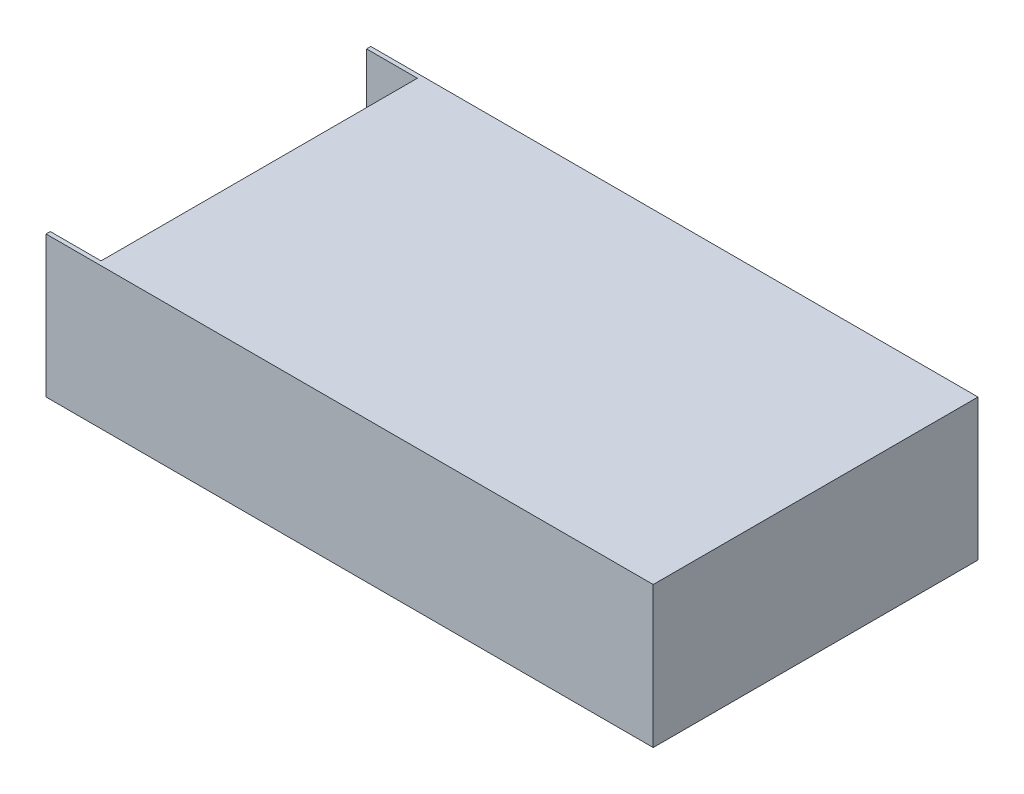
ISO-10303-21;
HEADER;
FILE_DESCRIPTION(('STEP AP214'),'2;1');
FILE_NAME('part.step','',(''),(''),'','','');
FILE_SCHEMA(('AUTOMOTIVE_DESIGN { 1 0 10303 214 1 1 1 1 }'));
ENDSEC;
DATA;
#1=APPLICATION_CONTEXT('core data for automotive mechanical design processes');
#2=APPLICATION_PROTOCOL_DEFINITION('international standard','automotive_design',2000,#1);
#3=PRODUCT_CONTEXT('',#1,'mechanical');
#4=PRODUCT('Part','Part','',(#3));
#5=PRODUCT_RELATED_PRODUCT_CATEGORY('part','',(#4));
#6=PRODUCT_DEFINITION_FORMATION('','',#4);
#7=PRODUCT_DEFINITION_CONTEXT('part definition',#1,'design');
#8=PRODUCT_DEFINITION('design','',#6,#7);
#9=PRODUCT_DEFINITION_SHAPE('','',#8);
#10=(LENGTH_UNIT() NAMED_UNIT(*) SI_UNIT(.MILLI.,.METRE.));
#11=(NAMED_UNIT(*) PLANE_ANGLE_UNIT() SI_UNIT($,.RADIAN.));
#12=(NAMED_UNIT(*) SI_UNIT($,.STERADIAN.) SOLID_ANGLE_UNIT());
#13=UNCERTAINTY_MEASURE_WITH_UNIT(LENGTH_MEASURE(1.E-05),#10,'distance_accuracy_value','');
#14=(GEOMETRIC_REPRESENTATION_CONTEXT(3) GLOBAL_UNCERTAINTY_ASSIGNED_CONTEXT((#13)) GLOBAL_UNIT_ASSIGNED_CONTEXT((#10,
#11,#12)) REPRESENTATION_CONTEXT('',''));
#15=CARTESIAN_POINT('',(0.,0.,0.));
#16=DIRECTION('',(0.,0.,1.));
#17=DIRECTION('',(1.,0.,0.));
#18=AXIS2_PLACEMENT_3D('',#15,#16,#17);
#19=CARTESIAN_POINT('',(0.,0.,0.));
#20=DIRECTION('',(0.,-1.,0.));
#21=DIRECTION('',(0.,0.,-1.));
#22=AXIS2_PLACEMENT_3D('',#19,#20,#21);
#23=PLANE('',#22);
#24=DIRECTION('',(0.,0.,-1.));
#25=VECTOR('',#24,1.);
#26=CARTESIAN_POINT('',(107.5,0.,57.5));
#27=LINE('',#26,#25);
#28=CARTESIAN_POINT('',(107.5,0.,57.5));
#29=VERTEX_POINT('',#28);
#30=CARTESIAN_POINT('',(107.5,0.,-57.5));
#31=VERTEX_POINT('',#30);
#32=EDGE_CURVE('E215',#29,#31,#27,.T.);
#33=ORIENTED_EDGE('',*,*,#32,.F.);
#34=DIRECTION('',(1.,0.,0.));
#35=VECTOR('',#34,1.);
#36=CARTESIAN_POINT('',(-107.5,0.,57.5));
#37=LINE('',#36,#35);
#38=CARTESIAN_POINT('',(-107.5,0.,57.5));
#39=VERTEX_POINT('',#38);
#40=EDGE_CURVE('E225',#39,#29,#37,.T.);
#41=ORIENTED_EDGE('',*,*,#40,.F.);
#42=DIRECTION('',(0.,0.,1.));
#43=VECTOR('',#42,1.);
#44=CARTESIAN_POINT('',(-107.5,0.,57.5));
#45=LINE('',#44,#43);
#46=CARTESIAN_POINT('',(-107.5,0.,-57.5));
#47=VERTEX_POINT('',#46);
#48=EDGE_CURVE('E238',#47,#39,#45,.T.);
#49=ORIENTED_EDGE('',*,*,#48,.F.);
#50=DIRECTION('',(-1.,0.,0.));
#51=VECTOR('',#50,1.);
#52=CARTESIAN_POINT('',(-107.5,0.,-57.5));
#53=LINE('',#52,#51);
#54=EDGE_CURVE('E236',#31,#47,#53,.T.);
#55=ORIENTED_EDGE('',*,*,#54,.F.);
#56=EDGE_LOOP('',(#33,#41,#49,#55));
#57=FACE_BOUND('',#56,.T.);
#58=DIRECTION('',(1.,0.,0.));
#59=VECTOR('',#58,1.);
#60=CARTESIAN_POINT('',(0.,0.,52.5));
#61=LINE('',#60,#59);
#62=CARTESIAN_POINT('',(-102.5,0.,52.5));
#63=VERTEX_POINT('',#62);
#64=CARTESIAN_POINT('',(102.5,0.,52.5));
#65=VERTEX_POINT('',#64);
#66=EDGE_CURVE('E158',#63,#65,#61,.T.);
#67=ORIENTED_EDGE('',*,*,#66,.T.);
#68=DIRECTION('',(0.,0.,-1.));
#69=VECTOR('',#68,1.);
#70=CARTESIAN_POINT('',(102.5,0.,0.));
#71=LINE('',#70,#69);
#72=CARTESIAN_POINT('',(102.5,0.,-52.5));
#73=VERTEX_POINT('',#72);
#74=EDGE_CURVE('E182',#65,#73,#71,.T.);
#75=ORIENTED_EDGE('',*,*,#74,.T.);
#76=DIRECTION('',(-1.,0.,0.));
#77=VECTOR('',#76,1.);
#78=CARTESIAN_POINT('',(0.,0.,-52.5));
#79=LINE('',#78,#77);
#80=CARTESIAN_POINT('',(-102.5,0.,-52.5));
#81=VERTEX_POINT('',#80);
#82=EDGE_CURVE('E162',#73,#81,#79,.T.);
#83=ORIENTED_EDGE('',*,*,#82,.T.);
#84=DIRECTION('',(0.,0.,1.));
#85=VECTOR('',#84,1.);
#86=CARTESIAN_POINT('',(-102.5,0.,0.));
#87=LINE('',#86,#85);
#88=EDGE_CURVE('E49',#81,#63,#87,.T.);
#89=ORIENTED_EDGE('',*,*,#88,.T.);
#90=EDGE_LOOP('',(#67,#75,#83,#89));
#91=FACE_BOUND('',#90,.T.);
#92=ADVANCED_FACE('F34',(#57,#91),#23,.T.);
#93=CARTESIAN_POINT('',(107.5,50.,57.5));
#94=DIRECTION('',(-1.,0.,0.));
#95=DIRECTION('',(0.,0.,1.));
#96=AXIS2_PLACEMENT_3D('',#93,#94,#95);
#97=PLANE('',#96);
#98=ORIENTED_EDGE('',*,*,#32,.T.);
#99=DIRECTION('',(0.,-1.,0.));
#100=VECTOR('',#99,1.);
#101=CARTESIAN_POINT('',(107.5,50.,-57.5));
#102=LINE('',#101,#100);
#103=CARTESIAN_POINT('',(107.5,50.,-57.5));
#104=VERTEX_POINT('',#103);
#105=EDGE_CURVE('E11',#104,#31,#102,.T.);
#106=ORIENTED_EDGE('',*,*,#105,.F.);
#107=DIRECTION('',(0.,0.,-1.));
#108=VECTOR('',#107,1.);
#109=CARTESIAN_POINT('',(107.5,50.,57.5));
#110=LINE('',#109,#108);
#111=CARTESIAN_POINT('',(107.5,50.,57.5));
#112=VERTEX_POINT('',#111);
#113=EDGE_CURVE('E221',#112,#104,#110,.T.);
#114=ORIENTED_EDGE('',*,*,#113,.F.);
#115=DIRECTION('',(0.,-1.,0.));
#116=VECTOR('',#115,1.);
#117=CARTESIAN_POINT('',(107.5,50.,57.5));
#118=LINE('',#117,#116);
#119=EDGE_CURVE('E233',#112,#29,#118,.T.);
#120=ORIENTED_EDGE('',*,*,#119,.T.);
#121=EDGE_LOOP('',(#98,#106,#114,#120));
#122=FACE_BOUND('',#121,.T.);
#123=ADVANCED_FACE('F36',(#122),#97,.F.);
#124=CARTESIAN_POINT('',(-107.5,50.,-57.5));
#125=DIRECTION('',(0.,0.,1.));
#126=DIRECTION('',(1.,0.,0.));
#127=AXIS2_PLACEMENT_3D('',#124,#125,#126);
#128=PLANE('',#127);
#129=ORIENTED_EDGE('',*,*,#54,.T.);
#130=DIRECTION('',(0.,-1.,0.));
#131=VECTOR('',#130,1.);
#132=CARTESIAN_POINT('',(-107.5,50.,-57.5));
#133=LINE('',#132,#131);
#134=CARTESIAN_POINT('',(-107.5,50.,-57.5));
#135=VERTEX_POINT('',#134);
#136=EDGE_CURVE('E42',#135,#47,#133,.T.);
#137=ORIENTED_EDGE('',*,*,#136,.F.);
#138=DIRECTION('',(-1.,0.,0.));
#139=VECTOR('',#138,1.);
#140=CARTESIAN_POINT('',(-107.5,50.,-57.5));
#141=LINE('',#140,#139);
#142=EDGE_CURVE('E224',#104,#135,#141,.T.);
#143=ORIENTED_EDGE('',*,*,#142,.F.);
#144=ORIENTED_EDGE('',*,*,#105,.T.);
#145=EDGE_LOOP('',(#129,#137,#143,#144));
#146=FACE_BOUND('',#145,.T.);
#147=ADVANCED_FACE('F293',(#146),#128,.F.);
#148=CARTESIAN_POINT('',(-107.5,50.,57.5));
#149=DIRECTION('',(1.,0.,0.));
#150=DIRECTION('',(0.,0.,-1.));
#151=AXIS2_PLACEMENT_3D('',#148,#149,#150);
#152=PLANE('',#151);
#153=DIRECTION('',(0.,0.,1.));
#154=VECTOR('',#153,1.);
#155=CARTESIAN_POINT('',(-107.5,25.,-56.));
#156=LINE('',#155,#154);
#157=CARTESIAN_POINT('',(-107.5,25.,-56.));
#158=VERTEX_POINT('',#157);
#159=CARTESIAN_POINT('',(-107.5,25.,56.));
#160=VERTEX_POINT('',#159);
#161=EDGE_CURVE('E194',#158,#160,#156,.T.);
#162=ORIENTED_EDGE('',*,*,#161,.F.);
#163=DIRECTION('',(0.,1.,0.));
#164=VECTOR('',#163,1.);
#165=CARTESIAN_POINT('',(-107.5,25.,-56.));
#166=LINE('',#165,#164);
#167=CARTESIAN_POINT('',(-107.5,50.,-56.));
#168=VERTEX_POINT('',#167);
#169=EDGE_CURVE('E212',#158,#168,#166,.T.);
#170=ORIENTED_EDGE('',*,*,#169,.T.);
#171=DIRECTION('',(0.,0.,1.));
#172=VECTOR('',#171,1.);
#173=CARTESIAN_POINT('',(-107.5,50.,57.5));
#174=LINE('',#173,#172);
#175=EDGE_CURVE('E228',#135,#168,#174,.T.);
#176=ORIENTED_EDGE('',*,*,#175,.F.);
#177=ORIENTED_EDGE('',*,*,#136,.T.);
#178=ORIENTED_EDGE('',*,*,#48,.T.);
#179=DIRECTION('',(0.,-1.,0.));
#180=VECTOR('',#179,1.);
#181=CARTESIAN_POINT('',(-107.5,50.,57.5));
#182=LINE('',#181,#180);
#183=CARTESIAN_POINT('',(-107.5,50.,57.5));
#184=VERTEX_POINT('',#183);
#185=EDGE_CURVE('E243',#184,#39,#182,.T.);
#186=ORIENTED_EDGE('',*,*,#185,.F.);
#187=CARTESIAN_POINT('',(-107.5,50.,56.));
#188=VERTEX_POINT('',#187);
#189=EDGE_CURVE('E227',#188,#184,#174,.T.);
#190=ORIENTED_EDGE('',*,*,#189,.F.);
#191=DIRECTION('',(0.,1.,0.));
#192=VECTOR('',#191,1.);
#193=CARTESIAN_POINT('',(-107.5,25.,56.));
#194=LINE('',#193,#192);
#195=EDGE_CURVE('E57',#160,#188,#194,.T.);
#196=ORIENTED_EDGE('',*,*,#195,.F.);
#197=EDGE_LOOP('',(#162,#170,#176,#177,#178,#186,#190,#196));
#198=FACE_BOUND('',#197,.T.);
#199=ADVANCED_FACE('F251',(#198),#152,.F.);
#200=CARTESIAN_POINT('',(-107.5,50.,57.5));
#201=DIRECTION('',(0.,0.,-1.));
#202=DIRECTION('',(-1.,0.,0.));
#203=AXIS2_PLACEMENT_3D('',#200,#201,#202);
#204=PLANE('',#203);
#205=ORIENTED_EDGE('',*,*,#40,.T.);
#206=ORIENTED_EDGE('',*,*,#119,.F.);
#207=DIRECTION('',(1.,0.,0.));
#208=VECTOR('',#207,1.);
#209=CARTESIAN_POINT('',(-107.5,50.,57.5));
#210=LINE('',#209,#208);
#211=EDGE_CURVE('E231',#184,#112,#210,.T.);
#212=ORIENTED_EDGE('',*,*,#211,.F.);
#213=ORIENTED_EDGE('',*,*,#185,.T.);
#214=EDGE_LOOP('',(#205,#206,#212,#213));
#215=FACE_BOUND('',#214,.T.);
#216=ADVANCED_FACE('F260',(#215),#204,.F.);
#217=CARTESIAN_POINT('',(0.,50.,0.));
#218=DIRECTION('',(0.,-1.,0.));
#219=DIRECTION('',(0.,0.,-1.));
#220=AXIS2_PLACEMENT_3D('',#217,#218,#219);
#221=PLANE('',#220);
#222=ORIENTED_EDGE('',*,*,#175,.T.);
#223=DIRECTION('',(-1.,0.,0.));
#224=VECTOR('',#223,1.);
#225=CARTESIAN_POINT('',(-107.5,50.,-56.));
#226=LINE('',#225,#224);
#227=CARTESIAN_POINT('',(-89.5,50.,-56.));
#228=VERTEX_POINT('',#227);
#229=EDGE_CURVE('E198',#228,#168,#226,.T.);
#230=ORIENTED_EDGE('',*,*,#229,.F.);
#231=DIRECTION('',(0.,0.,-1.));
#232=VECTOR('',#231,1.);
#233=CARTESIAN_POINT('',(-89.5,50.,-56.));
#234=LINE('',#233,#232);
#235=CARTESIAN_POINT('',(-89.5,50.,56.));
#236=VERTEX_POINT('',#235);
#237=EDGE_CURVE('E208',#236,#228,#234,.T.);
#238=ORIENTED_EDGE('',*,*,#237,.F.);
#239=DIRECTION('',(1.,0.,0.));
#240=VECTOR('',#239,1.);
#241=CARTESIAN_POINT('',(-107.5,50.,56.));
#242=LINE('',#241,#240);
#243=EDGE_CURVE('E193',#188,#236,#242,.T.);
#244=ORIENTED_EDGE('',*,*,#243,.F.);
#245=ORIENTED_EDGE('',*,*,#189,.T.);
#246=ORIENTED_EDGE('',*,*,#211,.T.);
#247=ORIENTED_EDGE('',*,*,#113,.T.);
#248=ORIENTED_EDGE('',*,*,#142,.T.);
#249=EDGE_LOOP('',(#222,#230,#238,#244,#245,#246,#247,#248));
#250=FACE_BOUND('',#249,.T.);
#251=ADVANCED_FACE('F266',(#250),#221,.F.);
#252=CARTESIAN_POINT('',(-107.5,25.,-56.));
#253=DIRECTION('',(0.,0.,-1.));
#254=DIRECTION('',(-1.,0.,0.));
#255=AXIS2_PLACEMENT_3D('',#252,#253,#254);
#256=PLANE('',#255);
#257=ORIENTED_EDGE('',*,*,#229,.T.);
#258=ORIENTED_EDGE('',*,*,#169,.F.);
#259=DIRECTION('',(-1.,0.,0.));
#260=VECTOR('',#259,1.);
#261=CARTESIAN_POINT('',(-107.5,25.,-56.));
#262=LINE('',#261,#260);
#263=CARTESIAN_POINT('',(-89.5,25.,-56.));
#264=VERTEX_POINT('',#263);
#265=EDGE_CURVE('E204',#264,#158,#262,.T.);
#266=ORIENTED_EDGE('',*,*,#265,.F.);
#267=DIRECTION('',(0.,1.,0.));
#268=VECTOR('',#267,1.);
#269=CARTESIAN_POINT('',(-89.5,25.,-56.));
#270=LINE('',#269,#268);
#271=EDGE_CURVE('E216',#264,#228,#270,.T.);
#272=ORIENTED_EDGE('',*,*,#271,.T.);
#273=EDGE_LOOP('',(#257,#258,#266,#272));
#274=FACE_BOUND('',#273,.T.);
#275=ADVANCED_FACE('F274',(#274),#256,.F.);
#276=CARTESIAN_POINT('',(-89.5,25.,-56.));
#277=DIRECTION('',(1.,0.,0.));
#278=DIRECTION('',(0.,0.,-1.));
#279=AXIS2_PLACEMENT_3D('',#276,#277,#278);
#280=PLANE('',#279);
#281=ORIENTED_EDGE('',*,*,#237,.T.);
#282=ORIENTED_EDGE('',*,*,#271,.F.);
#283=DIRECTION('',(0.,0.,-1.));
#284=VECTOR('',#283,1.);
#285=CARTESIAN_POINT('',(-89.5,25.,-56.));
#286=LINE('',#285,#284);
#287=CARTESIAN_POINT('',(-89.5,25.,56.));
#288=VERTEX_POINT('',#287);
#289=EDGE_CURVE('E201',#288,#264,#286,.T.);
#290=ORIENTED_EDGE('',*,*,#289,.F.);
#291=DIRECTION('',(0.,1.,0.));
#292=VECTOR('',#291,1.);
#293=CARTESIAN_POINT('',(-89.5,25.,56.));
#294=LINE('',#293,#292);
#295=EDGE_CURVE('E218',#288,#236,#294,.T.);
#296=ORIENTED_EDGE('',*,*,#295,.T.);
#297=EDGE_LOOP('',(#281,#282,#290,#296));
#298=FACE_BOUND('',#297,.T.);
#299=ADVANCED_FACE('F277',(#298),#280,.F.);
#300=CARTESIAN_POINT('',(-107.5,25.,56.));
#301=DIRECTION('',(0.,0.,1.));
#302=DIRECTION('',(1.,0.,0.));
#303=AXIS2_PLACEMENT_3D('',#300,#301,#302);
#304=PLANE('',#303);
#305=ORIENTED_EDGE('',*,*,#243,.T.);
#306=ORIENTED_EDGE('',*,*,#295,.F.);
#307=DIRECTION('',(1.,0.,0.));
#308=VECTOR('',#307,1.);
#309=CARTESIAN_POINT('',(-107.5,25.,56.));
#310=LINE('',#309,#308);
#311=EDGE_CURVE('E197',#160,#288,#310,.T.);
#312=ORIENTED_EDGE('',*,*,#311,.F.);
#313=ORIENTED_EDGE('',*,*,#195,.T.);
#314=EDGE_LOOP('',(#305,#306,#312,#313));
#315=FACE_BOUND('',#314,.T.);
#316=ADVANCED_FACE('F278',(#315),#304,.F.);
#317=CARTESIAN_POINT('',(0.,25.,0.));
#318=DIRECTION('',(0.,1.,0.));
#319=DIRECTION('',(0.,0.,1.));
#320=AXIS2_PLACEMENT_3D('',#317,#318,#319);
#321=PLANE('',#320);
#322=ORIENTED_EDGE('',*,*,#161,.T.);
#323=ORIENTED_EDGE('',*,*,#311,.T.);
#324=ORIENTED_EDGE('',*,*,#289,.T.);
#325=ORIENTED_EDGE('',*,*,#265,.T.);
#326=EDGE_LOOP('',(#322,#323,#324,#325));
#327=FACE_BOUND('',#326,.T.);
#328=ADVANCED_FACE('F270',(#327),#321,.T.);
#329=CARTESIAN_POINT('',(102.5,50.,57.5));
#330=DIRECTION('',(-1.,0.,0.));
#331=DIRECTION('',(0.,0.,1.));
#332=AXIS2_PLACEMENT_3D('',#329,#330,#331);
#333=PLANE('',#332);
#334=ORIENTED_EDGE('',*,*,#74,.F.);
#335=DIRECTION('',(0.,-1.,0.));
#336=VECTOR('',#335,1.);
#337=CARTESIAN_POINT('',(102.5,50.,52.5));
#338=LINE('',#337,#336);
#339=CARTESIAN_POINT('',(102.5,45.,52.5));
#340=VERTEX_POINT('',#339);
#341=EDGE_CURVE('E157',#340,#65,#338,.T.);
#342=ORIENTED_EDGE('',*,*,#341,.F.);
#343=DIRECTION('',(0.,0.,-1.));
#344=VECTOR('',#343,1.);
#345=CARTESIAN_POINT('',(102.5,45.,0.));
#346=LINE('',#345,#344);
#347=CARTESIAN_POINT('',(102.5,45.,-52.5));
#348=VERTEX_POINT('',#347);
#349=EDGE_CURVE('E142',#340,#348,#346,.T.);
#350=ORIENTED_EDGE('',*,*,#349,.T.);
#351=DIRECTION('',(0.,-1.,0.));
#352=VECTOR('',#351,1.);
#353=CARTESIAN_POINT('',(102.5,50.,-52.5));
#354=LINE('',#353,#352);
#355=EDGE_CURVE('E155',#348,#73,#354,.T.);
#356=ORIENTED_EDGE('',*,*,#355,.T.);
#357=EDGE_LOOP('',(#334,#342,#350,#356));
#358=FACE_BOUND('',#357,.T.);
#359=ADVANCED_FACE('F154',(#358),#333,.T.);
#360=CARTESIAN_POINT('',(-107.5,50.,-52.5));
#361=DIRECTION('',(0.,0.,1.));
#362=DIRECTION('',(1.,0.,0.));
#363=AXIS2_PLACEMENT_3D('',#360,#361,#362);
#364=PLANE('',#363);
#365=DIRECTION('',(-1.,0.,0.));
#366=VECTOR('',#365,1.);
#367=CARTESIAN_POINT('',(-107.5,20.,-52.5));
#368=LINE('',#367,#366);
#369=CARTESIAN_POINT('',(-84.5,20.,-52.5));
#370=VERTEX_POINT('',#369);
#371=CARTESIAN_POINT('',(-102.5,20.,-52.5));
#372=VERTEX_POINT('',#371);
#373=EDGE_CURVE('E189',#370,#372,#368,.T.);
#374=ORIENTED_EDGE('',*,*,#373,.T.);
#375=DIRECTION('',(0.,-1.,0.));
#376=VECTOR('',#375,1.);
#377=CARTESIAN_POINT('',(-102.5,50.,-52.5));
#378=LINE('',#377,#376);
#379=EDGE_CURVE('E164',#372,#81,#378,.T.);
#380=ORIENTED_EDGE('',*,*,#379,.T.);
#381=ORIENTED_EDGE('',*,*,#82,.F.);
#382=ORIENTED_EDGE('',*,*,#355,.F.);
#383=DIRECTION('',(-1.,0.,0.));
#384=VECTOR('',#383,1.);
#385=CARTESIAN_POINT('',(0.,45.,-52.5));
#386=LINE('',#385,#384);
#387=CARTESIAN_POINT('',(-84.5,45.,-52.5));
#388=VERTEX_POINT('',#387);
#389=EDGE_CURVE('E138',#348,#388,#386,.T.);
#390=ORIENTED_EDGE('',*,*,#389,.T.);
#391=DIRECTION('',(0.,-1.,0.));
#392=VECTOR('',#391,1.);
#393=CARTESIAN_POINT('',(-84.5,25.,-52.5));
#394=LINE('',#393,#392);
#395=EDGE_CURVE('E167',#388,#370,#394,.T.);
#396=ORIENTED_EDGE('',*,*,#395,.T.);
#397=EDGE_LOOP('',(#374,#380,#381,#382,#390,#396));
#398=FACE_BOUND('',#397,.T.);
#399=ADVANCED_FACE('F160',(#398),#364,.T.);
#400=CARTESIAN_POINT('',(-102.5,50.,57.5));
#401=DIRECTION('',(1.,0.,0.));
#402=DIRECTION('',(0.,0.,-1.));
#403=AXIS2_PLACEMENT_3D('',#400,#401,#402);
#404=PLANE('',#403);
#405=DIRECTION('',(0.,-1.,0.));
#406=VECTOR('',#405,1.);
#407=CARTESIAN_POINT('',(-102.5,50.,52.5));
#408=LINE('',#407,#406);
#409=CARTESIAN_POINT('',(-102.5,20.,52.5));
#410=VERTEX_POINT('',#409);
#411=EDGE_CURVE('E169',#410,#63,#408,.T.);
#412=ORIENTED_EDGE('',*,*,#411,.T.);
#413=ORIENTED_EDGE('',*,*,#88,.F.);
#414=ORIENTED_EDGE('',*,*,#379,.F.);
#415=DIRECTION('',(0.,0.,1.));
#416=VECTOR('',#415,1.);
#417=CARTESIAN_POINT('',(-102.5,20.,57.5));
#418=LINE('',#417,#416);
#419=EDGE_CURVE('E173',#372,#410,#418,.T.);
#420=ORIENTED_EDGE('',*,*,#419,.T.);
#421=EDGE_LOOP('',(#412,#413,#414,#420));
#422=FACE_BOUND('',#421,.T.);
#423=ADVANCED_FACE('F357',(#422),#404,.T.);
#424=CARTESIAN_POINT('',(-107.5,50.,52.5));
#425=DIRECTION('',(0.,0.,-1.));
#426=DIRECTION('',(-1.,0.,0.));
#427=AXIS2_PLACEMENT_3D('',#424,#425,#426);
#428=PLANE('',#427);
#429=DIRECTION('',(0.,-1.,0.));
#430=VECTOR('',#429,1.);
#431=CARTESIAN_POINT('',(-84.5,50.,52.5));
#432=LINE('',#431,#430);
#433=CARTESIAN_POINT('',(-84.5,45.,52.5));
#434=VERTEX_POINT('',#433);
#435=CARTESIAN_POINT('',(-84.5,20.,52.5));
#436=VERTEX_POINT('',#435);
#437=EDGE_CURVE('E163',#434,#436,#432,.T.);
#438=ORIENTED_EDGE('',*,*,#437,.F.);
#439=DIRECTION('',(1.,0.,0.));
#440=VECTOR('',#439,1.);
#441=CARTESIAN_POINT('',(0.,45.,52.5));
#442=LINE('',#441,#440);
#443=EDGE_CURVE('E148',#434,#340,#442,.T.);
#444=ORIENTED_EDGE('',*,*,#443,.T.);
#445=ORIENTED_EDGE('',*,*,#341,.T.);
#446=ORIENTED_EDGE('',*,*,#66,.F.);
#447=ORIENTED_EDGE('',*,*,#411,.F.);
#448=DIRECTION('',(-1.,0.,0.));
#449=VECTOR('',#448,1.);
#450=CARTESIAN_POINT('',(0.,20.,52.5));
#451=LINE('',#450,#449);
#452=EDGE_CURVE('E191',#436,#410,#451,.T.);
#453=ORIENTED_EDGE('',*,*,#452,.F.);
#454=EDGE_LOOP('',(#438,#444,#445,#446,#447,#453));
#455=FACE_BOUND('',#454,.T.);
#456=ADVANCED_FACE('F366',(#455),#428,.T.);
#457=CARTESIAN_POINT('',(0.,45.,0.));
#458=DIRECTION('',(0.,-1.,0.));
#459=DIRECTION('',(0.,0.,-1.));
#460=AXIS2_PLACEMENT_3D('',#457,#458,#459);
#461=PLANE('',#460);
#462=ORIENTED_EDGE('',*,*,#389,.F.);
#463=ORIENTED_EDGE('',*,*,#349,.F.);
#464=ORIENTED_EDGE('',*,*,#443,.F.);
#465=DIRECTION('',(0.,0.,-1.));
#466=VECTOR('',#465,1.);
#467=CARTESIAN_POINT('',(-84.5,45.,-56.));
#468=LINE('',#467,#466);
#469=EDGE_CURVE('E144',#434,#388,#468,.T.);
#470=ORIENTED_EDGE('',*,*,#469,.T.);
#471=EDGE_LOOP('',(#462,#463,#464,#470));
#472=FACE_BOUND('',#471,.T.);
#473=ADVANCED_FACE('F140',(#472),#461,.T.);
#474=CARTESIAN_POINT('',(-84.5,25.,-56.));
#475=DIRECTION('',(1.,0.,0.));
#476=DIRECTION('',(0.,0.,-1.));
#477=AXIS2_PLACEMENT_3D('',#474,#475,#476);
#478=PLANE('',#477);
#479=ORIENTED_EDGE('',*,*,#469,.F.);
#480=ORIENTED_EDGE('',*,*,#437,.T.);
#481=DIRECTION('',(0.,0.,-1.));
#482=VECTOR('',#481,1.);
#483=CARTESIAN_POINT('',(-84.5,20.,0.));
#484=LINE('',#483,#482);
#485=EDGE_CURVE('E176',#436,#370,#484,.T.);
#486=ORIENTED_EDGE('',*,*,#485,.T.);
#487=ORIENTED_EDGE('',*,*,#395,.F.);
#488=EDGE_LOOP('',(#479,#480,#486,#487));
#489=FACE_BOUND('',#488,.T.);
#490=ADVANCED_FACE('F384',(#489),#478,.T.);
#491=CARTESIAN_POINT('',(0.,20.,0.));
#492=DIRECTION('',(0.,1.,0.));
#493=DIRECTION('',(0.,0.,1.));
#494=AXIS2_PLACEMENT_3D('',#491,#492,#493);
#495=PLANE('',#494);
#496=ORIENTED_EDGE('',*,*,#452,.T.);
#497=ORIENTED_EDGE('',*,*,#419,.F.);
#498=ORIENTED_EDGE('',*,*,#373,.F.);
#499=ORIENTED_EDGE('',*,*,#485,.F.);
#500=EDGE_LOOP('',(#496,#497,#498,#499));
#501=FACE_BOUND('',#500,.T.);
#502=ADVANCED_FACE('F393',(#501),#495,.F.);
#503=CLOSED_SHELL('',(#92,#123,#147,#199,#216,#251,#275,#299,#316,#328,#359,#399,#423,#456,#473,
#490,#502));
#504=MANIFOLD_SOLID_BREP('B2',#503);
#505=ADVANCED_BREP_SHAPE_REPRESENTATION('',(#18,#504),#14);
#506=SHAPE_DEFINITION_REPRESENTATION(#9,#505);
ENDSEC;
END-ISO-10303-21;
